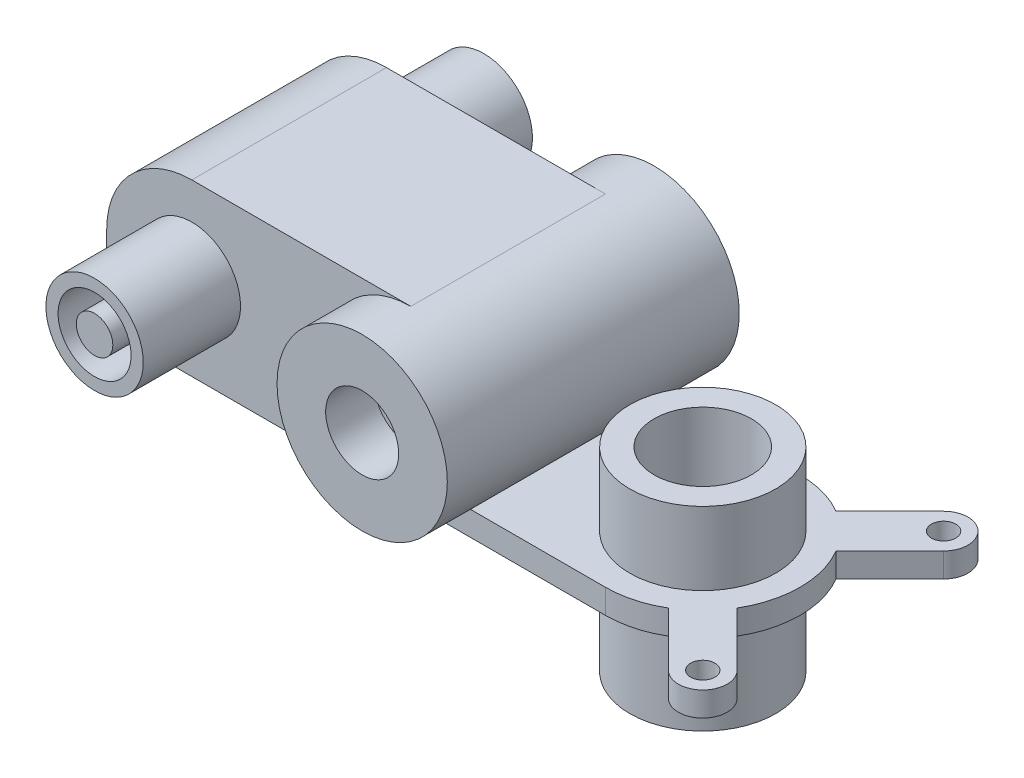
ISO-10303-21;
HEADER;
FILE_DESCRIPTION(('STEP AP214'),'2;1');
FILE_NAME('part.step','',(''),(''),'','','');
FILE_SCHEMA(('AUTOMOTIVE_DESIGN { 1 0 10303 214 1 1 1 1 }'));
ENDSEC;
DATA;
#1=APPLICATION_CONTEXT('core data for automotive mechanical design processes');
#2=APPLICATION_PROTOCOL_DEFINITION('international standard','automotive_design',2000,#1);
#3=PRODUCT_CONTEXT('',#1,'mechanical');
#4=PRODUCT('Part','Part','',(#3));
#5=PRODUCT_RELATED_PRODUCT_CATEGORY('part','',(#4));
#6=PRODUCT_DEFINITION_FORMATION('','',#4);
#7=PRODUCT_DEFINITION_CONTEXT('part definition',#1,'design');
#8=PRODUCT_DEFINITION('design','',#6,#7);
#9=PRODUCT_DEFINITION_SHAPE('','',#8);
#10=(LENGTH_UNIT() NAMED_UNIT(*) SI_UNIT(.MILLI.,.METRE.));
#11=(NAMED_UNIT(*) PLANE_ANGLE_UNIT() SI_UNIT($,.RADIAN.));
#12=(NAMED_UNIT(*) SI_UNIT($,.STERADIAN.) SOLID_ANGLE_UNIT());
#13=UNCERTAINTY_MEASURE_WITH_UNIT(LENGTH_MEASURE(1.E-05),#10,'distance_accuracy_value','');
#14=(GEOMETRIC_REPRESENTATION_CONTEXT(3) GLOBAL_UNCERTAINTY_ASSIGNED_CONTEXT((#13)) GLOBAL_UNIT_ASSIGNED_CONTEXT((#10,
#11,#12)) REPRESENTATION_CONTEXT('',''));
#15=CARTESIAN_POINT('',(0.,0.,0.));
#16=DIRECTION('',(0.,0.,1.));
#17=DIRECTION('',(1.,0.,0.));
#18=AXIS2_PLACEMENT_3D('',#15,#16,#17);
#19=CARTESIAN_POINT('',(-90.,0.,-80.));
#20=DIRECTION('',(0.,0.,1.));
#21=DIRECTION('',(1.,0.,0.));
#22=AXIS2_PLACEMENT_3D('',#19,#20,#21);
#23=CYLINDRICAL_SURFACE('',#22,35.);
#24=CARTESIAN_POINT('',(-90.,0.,0.));
#25=DIRECTION('',(0.,0.,1.));
#26=DIRECTION('',(1.,0.,0.));
#27=AXIS2_PLACEMENT_3D('',#24,#25,#26);
#28=CIRCLE('',#27,35.);
#29=CARTESIAN_POINT('',(-90.,35.,0.));
#30=VERTEX_POINT('',#29);
#31=CARTESIAN_POINT('',(-125.,0.,0.));
#32=VERTEX_POINT('',#31);
#33=EDGE_CURVE('E298',#30,#32,#28,.T.);
#34=ORIENTED_EDGE('',*,*,#33,.F.);
#35=DIRECTION('',(0.,0.,1.));
#36=VECTOR('',#35,1.);
#37=CARTESIAN_POINT('',(-90.,35.,-80.));
#38=LINE('',#37,#36);
#39=CARTESIAN_POINT('',(-90.,35.,-80.));
#40=VERTEX_POINT('',#39);
#41=EDGE_CURVE('E89',#40,#30,#38,.T.);
#42=ORIENTED_EDGE('',*,*,#41,.F.);
#43=CARTESIAN_POINT('',(-90.,0.,-80.));
#44=DIRECTION('',(0.,0.,1.));
#45=DIRECTION('',(1.,0.,0.));
#46=AXIS2_PLACEMENT_3D('',#43,#44,#45);
#47=CIRCLE('',#46,35.);
#48=CARTESIAN_POINT('',(-125.,0.,-80.));
#49=VERTEX_POINT('',#48);
#50=EDGE_CURVE('E302',#40,#49,#47,.T.);
#51=ORIENTED_EDGE('',*,*,#50,.T.);
#52=DIRECTION('',(0.,0.,1.));
#53=VECTOR('',#52,1.);
#54=CARTESIAN_POINT('',(-125.,0.,-80.));
#55=LINE('',#54,#53);
#56=EDGE_CURVE('E117',#49,#32,#55,.T.);
#57=ORIENTED_EDGE('',*,*,#56,.T.);
#58=EDGE_LOOP('',(#34,#42,#51,#57));
#59=FACE_BOUND('',#58,.T.);
#60=ADVANCED_FACE('F72',(#59),#23,.T.);
#61=CARTESIAN_POINT('',(0.,35.,-80.));
#62=DIRECTION('',(0.,-1.,0.));
#63=DIRECTION('',(1.,0.,0.));
#64=AXIS2_PLACEMENT_3D('',#61,#62,#63);
#65=PLANE('',#64);
#66=DIRECTION('',(1.,0.,0.));
#67=VECTOR('',#66,1.);
#68=CARTESIAN_POINT('',(0.,35.,0.));
#69=LINE('',#68,#67);
#70=CARTESIAN_POINT('',(0.,35.,0.));
#71=VERTEX_POINT('',#70);
#72=EDGE_CURVE('E306',#30,#71,#69,.T.);
#73=ORIENTED_EDGE('',*,*,#72,.T.);
#74=DIRECTION('',(0.,0.,1.));
#75=VECTOR('',#74,1.);
#76=CARTESIAN_POINT('',(0.,35.,-80.));
#77=LINE('',#76,#75);
#78=CARTESIAN_POINT('',(0.,35.,-80.));
#79=VERTEX_POINT('',#78);
#80=EDGE_CURVE('E330',#79,#71,#77,.T.);
#81=ORIENTED_EDGE('',*,*,#80,.F.);
#82=DIRECTION('',(1.,0.,0.));
#83=VECTOR('',#82,1.);
#84=CARTESIAN_POINT('',(0.,35.,-80.));
#85=LINE('',#84,#83);
#86=EDGE_CURVE('E312',#40,#79,#85,.T.);
#87=ORIENTED_EDGE('',*,*,#86,.F.);
#88=ORIENTED_EDGE('',*,*,#41,.T.);
#89=EDGE_LOOP('',(#73,#81,#87,#88));
#90=FACE_BOUND('',#89,.T.);
#91=ADVANCED_FACE('F369',(#90),#65,.F.);
#92=CARTESIAN_POINT('',(0.,0.,-80.));
#93=DIRECTION('',(0.,0.,1.));
#94=DIRECTION('',(1.,0.,0.));
#95=AXIS2_PLACEMENT_3D('',#92,#93,#94);
#96=CYLINDRICAL_SURFACE('',#95,35.);
#97=CARTESIAN_POINT('',(0.,0.,-80.));
#98=DIRECTION('',(0.,0.,-1.));
#99=DIRECTION('',(-1.,0.,0.));
#100=AXIS2_PLACEMENT_3D('',#97,#98,#99);
#101=CIRCLE('',#100,35.);
#102=CARTESIAN_POINT('',(0.,-35.,-80.));
#103=VERTEX_POINT('',#102);
#104=CARTESIAN_POINT('',(24.4948974278318,-25.,-80.));
#105=VERTEX_POINT('',#104);
#106=EDGE_CURVE('E12',#103,#105,#101,.F.);
#107=ORIENTED_EDGE('',*,*,#106,.F.);
#108=CARTESIAN_POINT('',(0.,0.,-80.));
#109=DIRECTION('',(0.,0.,-1.));
#110=DIRECTION('',(-1.,0.,0.));
#111=AXIS2_PLACEMENT_3D('',#108,#109,#110);
#112=CIRCLE('',#111,35.);
#113=EDGE_CURVE('E281',#103,#79,#112,.T.);
#114=ORIENTED_EDGE('',*,*,#113,.T.);
#115=ORIENTED_EDGE('',*,*,#80,.T.);
#116=CARTESIAN_POINT('',(0.,0.,0.));
#117=DIRECTION('',(0.,0.,1.));
#118=DIRECTION('',(1.,0.,0.));
#119=AXIS2_PLACEMENT_3D('',#116,#117,#118);
#120=CIRCLE('',#119,35.);
#121=CARTESIAN_POINT('',(0.,-35.,0.));
#122=VERTEX_POINT('',#121);
#123=EDGE_CURVE('E290',#71,#122,#120,.T.);
#124=ORIENTED_EDGE('',*,*,#123,.T.);
#125=CARTESIAN_POINT('',(0.,0.,0.));
#126=DIRECTION('',(0.,0.,1.));
#127=DIRECTION('',(1.,0.,0.));
#128=AXIS2_PLACEMENT_3D('',#125,#126,#127);
#129=CIRCLE('',#128,35.);
#130=CARTESIAN_POINT('',(24.4948974278318,-25.,0.));
#131=VERTEX_POINT('',#130);
#132=EDGE_CURVE('E81',#131,#122,#129,.F.);
#133=ORIENTED_EDGE('',*,*,#132,.F.);
#134=DIRECTION('',(0.,0.,1.));
#135=VECTOR('',#134,1.);
#136=CARTESIAN_POINT('',(24.4948974278318,-25.,-80.));
#137=LINE('',#136,#135);
#138=EDGE_CURVE('E350',#105,#131,#137,.T.);
#139=ORIENTED_EDGE('',*,*,#138,.F.);
#140=EDGE_LOOP('',(#107,#114,#115,#124,#133,#139));
#141=FACE_BOUND('',#140,.T.);
#142=CARTESIAN_POINT('',(0.,0.,20.));
#143=DIRECTION('',(0.,0.,1.));
#144=DIRECTION('',(1.,0.,0.));
#145=AXIS2_PLACEMENT_3D('',#142,#143,#144);
#146=CIRCLE('',#145,35.);
#147=CARTESIAN_POINT('',(35.,0.,20.));
#148=VERTEX_POINT('',#147);
#149=EDGE_CURVE('E294',#148,#148,#146,.T.);
#150=ORIENTED_EDGE('',*,*,#149,.F.);
#151=EDGE_LOOP('',(#150));
#152=FACE_BOUND('',#151,.T.);
#153=CARTESIAN_POINT('',(0.,0.,-100.));
#154=DIRECTION('',(0.,0.,-1.));
#155=DIRECTION('',(-1.,0.,0.));
#156=AXIS2_PLACEMENT_3D('',#153,#154,#155);
#157=CIRCLE('',#156,35.);
#158=CARTESIAN_POINT('',(-35.,0.,-100.));
#159=VERTEX_POINT('',#158);
#160=EDGE_CURVE('E273',#159,#159,#157,.T.);
#161=ORIENTED_EDGE('',*,*,#160,.F.);
#162=EDGE_LOOP('',(#161));
#163=FACE_BOUND('',#162,.T.);
#164=ADVANCED_FACE('F366',(#141,#152,#163),#96,.T.);
#165=CARTESIAN_POINT('',(0.,-35.,-80.));
#166=DIRECTION('',(0.,1.,0.));
#167=DIRECTION('',(0.,0.,1.));
#168=AXIS2_PLACEMENT_3D('',#165,#166,#167);
#169=PLANE('',#168);
#170=DIRECTION('',(-1.,0.,0.));
#171=VECTOR('',#170,1.);
#172=CARTESIAN_POINT('',(0.,-35.,0.));
#173=LINE('',#172,#171);
#174=CARTESIAN_POINT('',(-125.,-35.,0.));
#175=VERTEX_POINT('',#174);
#176=EDGE_CURVE('E323',#122,#175,#173,.T.);
#177=ORIENTED_EDGE('',*,*,#176,.T.);
#178=DIRECTION('',(0.,0.,1.));
#179=VECTOR('',#178,1.);
#180=CARTESIAN_POINT('',(-125.,-35.,-80.));
#181=LINE('',#180,#179);
#182=CARTESIAN_POINT('',(-125.,-35.,-80.));
#183=VERTEX_POINT('',#182);
#184=EDGE_CURVE('E334',#183,#175,#181,.T.);
#185=ORIENTED_EDGE('',*,*,#184,.F.);
#186=DIRECTION('',(-1.,0.,0.));
#187=VECTOR('',#186,1.);
#188=CARTESIAN_POINT('',(0.,-35.,-80.));
#189=LINE('',#188,#187);
#190=EDGE_CURVE('E309',#103,#183,#189,.T.);
#191=ORIENTED_EDGE('',*,*,#190,.F.);
#192=DIRECTION('',(1.,0.,0.));
#193=VECTOR('',#192,1.);
#194=CARTESIAN_POINT('',(0.,-35.,-80.));
#195=LINE('',#194,#193);
#196=CARTESIAN_POINT('',(80.,-35.,-80.));
#197=VERTEX_POINT('',#196);
#198=EDGE_CURVE('E379',#103,#197,#195,.T.);
#199=ORIENTED_EDGE('',*,*,#198,.T.);
#200=CARTESIAN_POINT('',(80.,-35.,-40.));
#201=DIRECTION('',(0.,1.,0.));
#202=DIRECTION('',(0.,0.,1.));
#203=AXIS2_PLACEMENT_3D('',#200,#201,#202);
#204=CIRCLE('',#203,40.);
#205=CARTESIAN_POINT('',(100.315060063393,-35.,-74.4571956871238));
#206=VERTEX_POINT('',#205);
#207=EDGE_CURVE('E382',#206,#197,#204,.T.);
#208=ORIENTED_EDGE('',*,*,#207,.F.);
#209=DIRECTION('',(0.707106781186547,0.,-0.707106781186548));
#210=VECTOR('',#209,1.);
#211=CARTESIAN_POINT('',(12.9289321881346,-35.,12.9289321881345));
#212=LINE('',#211,#210);
#213=CARTESIAN_POINT('',(122.426406871193,-35.,-96.5685424949238));
#214=VERTEX_POINT('',#213);
#215=EDGE_CURVE('E391',#206,#214,#212,.T.);
#216=ORIENTED_EDGE('',*,*,#215,.T.);
#217=CARTESIAN_POINT('',(129.497474683058,-35.,-89.4974746830584));
#218=DIRECTION('',(0.,1.,0.));
#219=DIRECTION('',(0.,0.,1.));
#220=AXIS2_PLACEMENT_3D('',#217,#218,#219);
#221=CIRCLE('',#220,10.0000000000001);
#222=CARTESIAN_POINT('',(136.568542494924,-35.,-82.4264068711929));
#223=VERTEX_POINT('',#222);
#224=EDGE_CURVE('E454',#223,#214,#221,.T.);
#225=ORIENTED_EDGE('',*,*,#224,.F.);
#226=DIRECTION('',(0.707106781186547,0.,-0.707106781186548));
#227=VECTOR('',#226,1.);
#228=CARTESIAN_POINT('',(27.0710678118656,-35.,27.0710678118655));
#229=LINE('',#228,#227);
#230=CARTESIAN_POINT('',(114.457195687124,-35.,-60.3150600633928));
#231=VERTEX_POINT('',#230);
#232=EDGE_CURVE('E441',#231,#223,#229,.T.);
#233=ORIENTED_EDGE('',*,*,#232,.F.);
#234=CARTESIAN_POINT('',(80.,-35.,-40.));
#235=DIRECTION('',(0.,1.,0.));
#236=DIRECTION('',(0.,0.,1.));
#237=AXIS2_PLACEMENT_3D('',#234,#235,#236);
#238=CIRCLE('',#237,40.);
#239=CARTESIAN_POINT('',(114.457195687124,-35.,-19.6849399366071));
#240=VERTEX_POINT('',#239);
#241=EDGE_CURVE('E433',#240,#231,#238,.T.);
#242=ORIENTED_EDGE('',*,*,#241,.F.);
#243=DIRECTION('',(0.707106781186548,0.,0.707106781186547));
#244=VECTOR('',#243,1.);
#245=CARTESIAN_POINT('',(67.0710678118654,-35.,-67.0710678118655));
#246=LINE('',#245,#244);
#247=CARTESIAN_POINT('',(136.568542494924,-35.,2.42640687119286));
#248=VERTEX_POINT('',#247);
#249=EDGE_CURVE('E439',#240,#248,#246,.T.);
#250=ORIENTED_EDGE('',*,*,#249,.T.);
#251=CARTESIAN_POINT('',(129.497474683058,-35.,9.49747468305841));
#252=DIRECTION('',(0.,1.,0.));
#253=DIRECTION('',(0.,0.,1.));
#254=AXIS2_PLACEMENT_3D('',#251,#252,#253);
#255=CIRCLE('',#254,10.0000000000001);
#256=CARTESIAN_POINT('',(122.426406871193,-35.,16.5685424949238));
#257=VERTEX_POINT('',#256);
#258=EDGE_CURVE('E446',#257,#248,#255,.T.);
#259=ORIENTED_EDGE('',*,*,#258,.F.);
#260=DIRECTION('',(0.707106781186548,0.,0.707106781186547));
#261=VECTOR('',#260,1.);
#262=CARTESIAN_POINT('',(52.9289321881345,-35.,-52.9289321881345));
#263=LINE('',#262,#261);
#264=CARTESIAN_POINT('',(100.315060063393,-35.,-5.5428043128762));
#265=VERTEX_POINT('',#264);
#266=EDGE_CURVE('E224',#265,#257,#263,.T.);
#267=ORIENTED_EDGE('',*,*,#266,.F.);
#268=CARTESIAN_POINT('',(80.,-35.,-40.));
#269=DIRECTION('',(0.,1.,0.));
#270=DIRECTION('',(0.,0.,1.));
#271=AXIS2_PLACEMENT_3D('',#268,#269,#270);
#272=CIRCLE('',#271,40.);
#273=CARTESIAN_POINT('',(80.,-35.,0.));
#274=VERTEX_POINT('',#273);
#275=EDGE_CURVE('E389',#274,#265,#272,.T.);
#276=ORIENTED_EDGE('',*,*,#275,.F.);
#277=DIRECTION('',(-1.,0.,0.));
#278=VECTOR('',#277,1.);
#279=CARTESIAN_POINT('',(0.,-35.,0.));
#280=LINE('',#279,#278);
#281=EDGE_CURVE('E108',#274,#122,#280,.T.);
#282=ORIENTED_EDGE('',*,*,#281,.T.);
#283=EDGE_LOOP('',(#177,#185,#191,#199,#208,#216,#225,#233,#242,#250,#259,#267,#276,#282));
#284=FACE_BOUND('',#283,.T.);
#285=CARTESIAN_POINT('',(80.,-35.,-40.));
#286=DIRECTION('',(0.,1.,0.));
#287=DIRECTION('',(0.,0.,1.));
#288=AXIS2_PLACEMENT_3D('',#285,#286,#287);
#289=CIRCLE('',#288,30.);
#290=CARTESIAN_POINT('',(80.,-35.,-10.));
#291=VERTEX_POINT('',#290);
#292=EDGE_CURVE('E506',#291,#291,#289,.F.);
#293=ORIENTED_EDGE('',*,*,#292,.F.);
#294=EDGE_LOOP('',(#293));
#295=FACE_BOUND('',#294,.T.);
#296=CARTESIAN_POINT('',(129.497474683058,-35.,9.49747468305841));
#297=DIRECTION('',(0.,1.,0.));
#298=DIRECTION('',(0.,0.,1.));
#299=AXIS2_PLACEMENT_3D('',#296,#297,#298);
#300=CIRCLE('',#299,4.99999999999999);
#301=CARTESIAN_POINT('',(129.497474683058,-35.,14.4974746830584));
#302=VERTEX_POINT('',#301);
#303=EDGE_CURVE('E397',#302,#302,#300,.T.);
#304=ORIENTED_EDGE('',*,*,#303,.T.);
#305=EDGE_LOOP('',(#304));
#306=FACE_BOUND('',#305,.T.);
#307=CARTESIAN_POINT('',(129.497474683058,-35.,-89.4974746830584));
#308=DIRECTION('',(0.,1.,0.));
#309=DIRECTION('',(0.,0.,1.));
#310=AXIS2_PLACEMENT_3D('',#307,#308,#309);
#311=CIRCLE('',#310,5.00000000000002);
#312=CARTESIAN_POINT('',(129.497474683058,-35.,-84.4974746830584));
#313=VERTEX_POINT('',#312);
#314=EDGE_CURVE('E220',#313,#313,#311,.T.);
#315=ORIENTED_EDGE('',*,*,#314,.T.);
#316=EDGE_LOOP('',(#315));
#317=FACE_BOUND('',#316,.T.);
#318=ADVANCED_FACE('F375',(#284,#295,#306,#317),#169,.F.);
#319=CARTESIAN_POINT('',(-125.,0.,-80.));
#320=DIRECTION('',(-1.,0.,0.));
#321=DIRECTION('',(0.,0.,1.));
#322=AXIS2_PLACEMENT_3D('',#319,#320,#321);
#323=PLANE('',#322);
#324=DIRECTION('',(0.,-1.,0.));
#325=VECTOR('',#324,1.);
#326=CARTESIAN_POINT('',(-125.,0.,0.));
#327=LINE('',#326,#325);
#328=EDGE_CURVE('E319',#32,#175,#327,.T.);
#329=ORIENTED_EDGE('',*,*,#328,.F.);
#330=ORIENTED_EDGE('',*,*,#56,.F.);
#331=DIRECTION('',(0.,-1.,0.));
#332=VECTOR('',#331,1.);
#333=CARTESIAN_POINT('',(-125.,0.,-80.));
#334=LINE('',#333,#332);
#335=EDGE_CURVE('E305',#49,#183,#334,.T.);
#336=ORIENTED_EDGE('',*,*,#335,.T.);
#337=ORIENTED_EDGE('',*,*,#184,.T.);
#338=EDGE_LOOP('',(#329,#330,#336,#337));
#339=FACE_BOUND('',#338,.T.);
#340=ADVANCED_FACE('F374',(#339),#323,.T.);
#341=CARTESIAN_POINT('',(0.,0.,-80.));
#342=DIRECTION('',(0.,0.,1.));
#343=DIRECTION('',(1.,0.,0.));
#344=AXIS2_PLACEMENT_3D('',#341,#342,#343);
#345=PLANE('',#344);
#346=CARTESIAN_POINT('',(-90.,0.,-80.));
#347=DIRECTION('',(0.,0.,1.));
#348=DIRECTION('',(1.,0.,0.));
#349=AXIS2_PLACEMENT_3D('',#346,#347,#348);
#350=CIRCLE('',#349,20.);
#351=CARTESIAN_POINT('',(-70.,0.,-80.));
#352=VERTEX_POINT('',#351);
#353=EDGE_CURVE('E342',#352,#352,#350,.F.);
#354=ORIENTED_EDGE('',*,*,#353,.F.);
#355=EDGE_LOOP('',(#354));
#356=FACE_BOUND('',#355,.T.);
#357=ORIENTED_EDGE('',*,*,#113,.F.);
#358=ORIENTED_EDGE('',*,*,#190,.T.);
#359=ORIENTED_EDGE('',*,*,#335,.F.);
#360=ORIENTED_EDGE('',*,*,#50,.F.);
#361=ORIENTED_EDGE('',*,*,#86,.T.);
#362=EDGE_LOOP('',(#357,#358,#359,#360,#361));
#363=FACE_BOUND('',#362,.T.);
#364=ADVANCED_FACE('F372',(#356,#363),#345,.F.);
#365=CARTESIAN_POINT('',(0.,0.,0.));
#366=DIRECTION('',(0.,0.,1.));
#367=DIRECTION('',(1.,0.,0.));
#368=AXIS2_PLACEMENT_3D('',#365,#366,#367);
#369=PLANE('',#368);
#370=CARTESIAN_POINT('',(-90.,0.,0.));
#371=DIRECTION('',(0.,0.,1.));
#372=DIRECTION('',(1.,0.,0.));
#373=AXIS2_PLACEMENT_3D('',#370,#371,#372);
#374=CIRCLE('',#373,20.);
#375=CARTESIAN_POINT('',(-70.,0.,0.));
#376=VERTEX_POINT('',#375);
#377=EDGE_CURVE('E253',#376,#376,#374,.T.);
#378=ORIENTED_EDGE('',*,*,#377,.F.);
#379=EDGE_LOOP('',(#378));
#380=FACE_BOUND('',#379,.T.);
#381=ORIENTED_EDGE('',*,*,#123,.F.);
#382=ORIENTED_EDGE('',*,*,#72,.F.);
#383=ORIENTED_EDGE('',*,*,#33,.T.);
#384=ORIENTED_EDGE('',*,*,#328,.T.);
#385=ORIENTED_EDGE('',*,*,#176,.F.);
#386=EDGE_LOOP('',(#381,#382,#383,#384,#385));
#387=FACE_BOUND('',#386,.T.);
#388=ADVANCED_FACE('F363',(#380,#387),#369,.T.);
#389=CARTESIAN_POINT('',(0.,0.,20.));
#390=DIRECTION('',(0.,0.,1.));
#391=DIRECTION('',(1.,0.,0.));
#392=AXIS2_PLACEMENT_3D('',#389,#390,#391);
#393=PLANE('',#392);
#394=ORIENTED_EDGE('',*,*,#149,.T.);
#395=EDGE_LOOP('',(#394));
#396=FACE_BOUND('',#395,.T.);
#397=CARTESIAN_POINT('',(0.,0.,20.));
#398=DIRECTION('',(0.,0.,1.));
#399=DIRECTION('',(1.,0.,0.));
#400=AXIS2_PLACEMENT_3D('',#397,#398,#399);
#401=CIRCLE('',#400,15.);
#402=CARTESIAN_POINT('',(15.,0.,20.));
#403=VERTEX_POINT('',#402);
#404=EDGE_CURVE('E286',#403,#403,#401,.T.);
#405=ORIENTED_EDGE('',*,*,#404,.F.);
#406=EDGE_LOOP('',(#405));
#407=FACE_BOUND('',#406,.T.);
#408=ADVANCED_FACE('F572',(#396,#407),#393,.T.);
#409=CARTESIAN_POINT('',(0.,0.,20.));
#410=DIRECTION('',(0.,0.,-1.));
#411=DIRECTION('',(-1.,0.,0.));
#412=AXIS2_PLACEMENT_3D('',#409,#410,#411);
#413=CYLINDRICAL_SURFACE('',#412,15.);
#414=ORIENTED_EDGE('',*,*,#404,.T.);
#415=EDGE_LOOP('',(#414));
#416=FACE_BOUND('',#415,.T.);
#417=CARTESIAN_POINT('',(0.,0.,0.));
#418=DIRECTION('',(0.,0.,1.));
#419=DIRECTION('',(1.,0.,0.));
#420=AXIS2_PLACEMENT_3D('',#417,#418,#419);
#421=CIRCLE('',#420,15.);
#422=CARTESIAN_POINT('',(15.,0.,0.));
#423=VERTEX_POINT('',#422);
#424=EDGE_CURVE('E280',#423,#423,#421,.T.);
#425=ORIENTED_EDGE('',*,*,#424,.F.);
#426=EDGE_LOOP('',(#425));
#427=FACE_BOUND('',#426,.T.);
#428=ADVANCED_FACE('F605',(#416,#427),#413,.F.);
#429=ORIENTED_EDGE('',*,*,#424,.T.);
#430=EDGE_LOOP('',(#429));
#431=FACE_BOUND('',#430,.T.);
#432=ADVANCED_FACE('F575',(#431),#369,.T.);
#433=CARTESIAN_POINT('',(0.,0.,-100.));
#434=DIRECTION('',(0.,0.,-1.));
#435=DIRECTION('',(-1.,0.,0.));
#436=AXIS2_PLACEMENT_3D('',#433,#434,#435);
#437=PLANE('',#436);
#438=ORIENTED_EDGE('',*,*,#160,.T.);
#439=EDGE_LOOP('',(#438));
#440=FACE_BOUND('',#439,.T.);
#441=CARTESIAN_POINT('',(0.,0.,-100.));
#442=DIRECTION('',(0.,0.,-1.));
#443=DIRECTION('',(-1.,0.,0.));
#444=AXIS2_PLACEMENT_3D('',#441,#442,#443);
#445=CIRCLE('',#444,15.);
#446=CARTESIAN_POINT('',(-15.,0.,-100.));
#447=VERTEX_POINT('',#446);
#448=EDGE_CURVE('E269',#447,#447,#445,.T.);
#449=ORIENTED_EDGE('',*,*,#448,.F.);
#450=EDGE_LOOP('',(#449));
#451=FACE_BOUND('',#450,.T.);
#452=ADVANCED_FACE('F593',(#440,#451),#437,.T.);
#453=CARTESIAN_POINT('',(0.,0.,-100.));
#454=DIRECTION('',(0.,0.,1.));
#455=DIRECTION('',(1.,0.,0.));
#456=AXIS2_PLACEMENT_3D('',#453,#454,#455);
#457=CYLINDRICAL_SURFACE('',#456,15.);
#458=ORIENTED_EDGE('',*,*,#448,.T.);
#459=EDGE_LOOP('',(#458));
#460=FACE_BOUND('',#459,.T.);
#461=CARTESIAN_POINT('',(0.,0.,-80.));
#462=DIRECTION('',(0.,0.,-1.));
#463=DIRECTION('',(-1.,0.,0.));
#464=AXIS2_PLACEMENT_3D('',#461,#462,#463);
#465=CIRCLE('',#464,15.);
#466=CARTESIAN_POINT('',(-15.,0.,-80.));
#467=VERTEX_POINT('',#466);
#468=EDGE_CURVE('E265',#467,#467,#465,.T.);
#469=ORIENTED_EDGE('',*,*,#468,.F.);
#470=EDGE_LOOP('',(#469));
#471=FACE_BOUND('',#470,.T.);
#472=ADVANCED_FACE('F584',(#460,#471),#457,.F.);
#473=ORIENTED_EDGE('',*,*,#468,.T.);
#474=EDGE_LOOP('',(#473));
#475=FACE_BOUND('',#474,.T.);
#476=ADVANCED_FACE('F568',(#475),#345,.F.);
#477=CARTESIAN_POINT('',(-90.,0.,40.));
#478=DIRECTION('',(0.,0.,-1.));
#479=DIRECTION('',(-1.,0.,0.));
#480=AXIS2_PLACEMENT_3D('',#477,#478,#479);
#481=CYLINDRICAL_SURFACE('',#480,15.);
#482=CARTESIAN_POINT('',(-90.,0.,40.));
#483=DIRECTION('',(0.,0.,1.));
#484=DIRECTION('',(1.,0.,0.));
#485=AXIS2_PLACEMENT_3D('',#482,#483,#484);
#486=CIRCLE('',#485,15.);
#487=CARTESIAN_POINT('',(-75.,0.,40.));
#488=VERTEX_POINT('',#487);
#489=EDGE_CURVE('E257',#488,#488,#486,.T.);
#490=ORIENTED_EDGE('',*,*,#489,.T.);
#491=EDGE_LOOP('',(#490));
#492=FACE_BOUND('',#491,.T.);
#493=CARTESIAN_POINT('',(-90.,0.,0.));
#494=DIRECTION('',(0.,0.,1.));
#495=DIRECTION('',(1.,0.,0.));
#496=AXIS2_PLACEMENT_3D('',#493,#494,#495);
#497=CIRCLE('',#496,15.);
#498=CARTESIAN_POINT('',(-75.,0.,0.));
#499=VERTEX_POINT('',#498);
#500=EDGE_CURVE('E285',#499,#499,#497,.F.);
#501=ORIENTED_EDGE('',*,*,#500,.T.);
#502=EDGE_LOOP('',(#501));
#503=FACE_BOUND('',#502,.T.);
#504=ADVANCED_FACE('F583',(#492,#503),#481,.F.);
#505=CARTESIAN_POINT('',(-90.,0.,40.));
#506=DIRECTION('',(0.,0.,-1.));
#507=DIRECTION('',(-1.,0.,0.));
#508=AXIS2_PLACEMENT_3D('',#505,#506,#507);
#509=CYLINDRICAL_SURFACE('',#508,20.);
#510=CARTESIAN_POINT('',(-90.,0.,40.));
#511=DIRECTION('',(0.,0.,1.));
#512=DIRECTION('',(1.,0.,0.));
#513=AXIS2_PLACEMENT_3D('',#510,#511,#512);
#514=CIRCLE('',#513,20.);
#515=CARTESIAN_POINT('',(-70.,0.,40.));
#516=VERTEX_POINT('',#515);
#517=EDGE_CURVE('E261',#516,#516,#514,.T.);
#518=ORIENTED_EDGE('',*,*,#517,.F.);
#519=EDGE_LOOP('',(#518));
#520=FACE_BOUND('',#519,.T.);
#521=ORIENTED_EDGE('',*,*,#377,.T.);
#522=EDGE_LOOP('',(#521));
#523=FACE_BOUND('',#522,.T.);
#524=ADVANCED_FACE('F590',(#520,#523),#509,.T.);
#525=CARTESIAN_POINT('',(0.,0.,40.));
#526=DIRECTION('',(0.,0.,1.));
#527=DIRECTION('',(1.,0.,0.));
#528=AXIS2_PLACEMENT_3D('',#525,#526,#527);
#529=PLANE('',#528);
#530=ORIENTED_EDGE('',*,*,#489,.F.);
#531=EDGE_LOOP('',(#530));
#532=FACE_BOUND('',#531,.T.);
#533=ORIENTED_EDGE('',*,*,#517,.T.);
#534=EDGE_LOOP('',(#533));
#535=FACE_BOUND('',#534,.T.);
#536=ADVANCED_FACE('F623',(#532,#535),#529,.T.);
#537=CARTESIAN_POINT('',(-90.,0.,0.));
#538=DIRECTION('',(0.,0.,1.));
#539=DIRECTION('',(1.,0.,0.));
#540=AXIS2_PLACEMENT_3D('',#537,#538,#539);
#541=CIRCLE('',#540,7.50000000000001);
#542=CARTESIAN_POINT('',(-82.5,0.,0.));
#543=VERTEX_POINT('',#542);
#544=EDGE_CURVE('E245',#543,#543,#541,.T.);
#545=ORIENTED_EDGE('',*,*,#544,.F.);
#546=EDGE_LOOP('',(#545));
#547=FACE_BOUND('',#546,.T.);
#548=ORIENTED_EDGE('',*,*,#500,.F.);
#549=EDGE_LOOP('',(#548));
#550=FACE_BOUND('',#549,.T.);
#551=ADVANCED_FACE('F574',(#547,#550),#369,.T.);
#552=CARTESIAN_POINT('',(-90.,0.,40.));
#553=DIRECTION('',(0.,0.,-1.));
#554=DIRECTION('',(-1.,0.,0.));
#555=AXIS2_PLACEMENT_3D('',#552,#553,#554);
#556=CYLINDRICAL_SURFACE('',#555,7.50000000000001);
#557=CARTESIAN_POINT('',(-90.,0.,40.));
#558=DIRECTION('',(0.,0.,1.));
#559=DIRECTION('',(1.,0.,0.));
#560=AXIS2_PLACEMENT_3D('',#557,#558,#559);
#561=CIRCLE('',#560,7.50000000000001);
#562=CARTESIAN_POINT('',(-82.5,0.,40.));
#563=VERTEX_POINT('',#562);
#564=EDGE_CURVE('E249',#563,#563,#561,.T.);
#565=ORIENTED_EDGE('',*,*,#564,.F.);
#566=EDGE_LOOP('',(#565));
#567=FACE_BOUND('',#566,.T.);
#568=ORIENTED_EDGE('',*,*,#544,.T.);
#569=EDGE_LOOP('',(#568));
#570=FACE_BOUND('',#569,.T.);
#571=ADVANCED_FACE('F622',(#567,#570),#556,.T.);
#572=CARTESIAN_POINT('',(0.,0.,40.));
#573=DIRECTION('',(0.,0.,1.));
#574=DIRECTION('',(1.,0.,0.));
#575=AXIS2_PLACEMENT_3D('',#572,#573,#574);
#576=PLANE('',#575);
#577=ORIENTED_EDGE('',*,*,#564,.T.);
#578=EDGE_LOOP('',(#577));
#579=FACE_BOUND('',#578,.T.);
#580=ADVANCED_FACE('F629',(#579),#576,.T.);
#581=CARTESIAN_POINT('',(-90.,0.,-120.));
#582=DIRECTION('',(0.,0.,1.));
#583=DIRECTION('',(1.,0.,0.));
#584=AXIS2_PLACEMENT_3D('',#581,#582,#583);
#585=CYLINDRICAL_SURFACE('',#584,15.);
#586=CARTESIAN_POINT('',(-90.,0.,-120.));
#587=DIRECTION('',(0.,0.,-1.));
#588=DIRECTION('',(-1.,0.,0.));
#589=AXIS2_PLACEMENT_3D('',#586,#587,#588);
#590=CIRCLE('',#589,15.);
#591=CARTESIAN_POINT('',(-105.,0.,-120.));
#592=VERTEX_POINT('',#591);
#593=EDGE_CURVE('E237',#592,#592,#590,.T.);
#594=ORIENTED_EDGE('',*,*,#593,.T.);
#595=EDGE_LOOP('',(#594));
#596=FACE_BOUND('',#595,.T.);
#597=CARTESIAN_POINT('',(-90.,0.,-80.));
#598=DIRECTION('',(0.,0.,-1.));
#599=DIRECTION('',(-1.,0.,0.));
#600=AXIS2_PLACEMENT_3D('',#597,#598,#599);
#601=CIRCLE('',#600,15.);
#602=CARTESIAN_POINT('',(-105.,0.,-80.));
#603=VERTEX_POINT('',#602);
#604=EDGE_CURVE('E231',#603,#603,#601,.T.);
#605=ORIENTED_EDGE('',*,*,#604,.F.);
#606=EDGE_LOOP('',(#605));
#607=FACE_BOUND('',#606,.T.);
#608=ADVANCED_FACE('F648',(#596,#607),#585,.F.);
#609=CARTESIAN_POINT('',(-90.,0.,-120.));
#610=DIRECTION('',(0.,0.,1.));
#611=DIRECTION('',(1.,0.,0.));
#612=AXIS2_PLACEMENT_3D('',#609,#610,#611);
#613=CYLINDRICAL_SURFACE('',#612,20.);
#614=CARTESIAN_POINT('',(-90.,0.,-120.));
#615=DIRECTION('',(0.,0.,-1.));
#616=DIRECTION('',(-1.,0.,0.));
#617=AXIS2_PLACEMENT_3D('',#614,#615,#616);
#618=CIRCLE('',#617,20.);
#619=CARTESIAN_POINT('',(-110.,0.,-120.));
#620=VERTEX_POINT('',#619);
#621=EDGE_CURVE('E241',#620,#620,#618,.T.);
#622=ORIENTED_EDGE('',*,*,#621,.F.);
#623=EDGE_LOOP('',(#622));
#624=FACE_BOUND('',#623,.T.);
#625=ORIENTED_EDGE('',*,*,#353,.T.);
#626=EDGE_LOOP('',(#625));
#627=FACE_BOUND('',#626,.T.);
#628=ADVANCED_FACE('F652',(#624,#627),#613,.T.);
#629=CARTESIAN_POINT('',(0.,0.,-120.));
#630=DIRECTION('',(0.,0.,-1.));
#631=DIRECTION('',(-1.,0.,0.));
#632=AXIS2_PLACEMENT_3D('',#629,#630,#631);
#633=PLANE('',#632);
#634=ORIENTED_EDGE('',*,*,#593,.F.);
#635=EDGE_LOOP('',(#634));
#636=FACE_BOUND('',#635,.T.);
#637=ORIENTED_EDGE('',*,*,#621,.T.);
#638=EDGE_LOOP('',(#637));
#639=FACE_BOUND('',#638,.T.);
#640=ADVANCED_FACE('F580',(#636,#639),#633,.T.);
#641=CARTESIAN_POINT('',(-90.,0.,-80.));
#642=DIRECTION('',(0.,0.,1.));
#643=DIRECTION('',(1.,0.,0.));
#644=AXIS2_PLACEMENT_3D('',#641,#642,#643);
#645=CIRCLE('',#644,7.50000000000001);
#646=CARTESIAN_POINT('',(-82.5,0.,-80.));
#647=VERTEX_POINT('',#646);
#648=EDGE_CURVE('E346',#647,#647,#645,.F.);
#649=ORIENTED_EDGE('',*,*,#648,.F.);
#650=EDGE_LOOP('',(#649));
#651=FACE_BOUND('',#650,.T.);
#652=ORIENTED_EDGE('',*,*,#604,.T.);
#653=EDGE_LOOP('',(#652));
#654=FACE_BOUND('',#653,.T.);
#655=ADVANCED_FACE('F567',(#651,#654),#345,.F.);
#656=CARTESIAN_POINT('',(-90.,0.,-120.));
#657=DIRECTION('',(0.,0.,1.));
#658=DIRECTION('',(1.,0.,0.));
#659=AXIS2_PLACEMENT_3D('',#656,#657,#658);
#660=CYLINDRICAL_SURFACE('',#659,7.50000000000001);
#661=CARTESIAN_POINT('',(-90.,0.,-120.));
#662=DIRECTION('',(0.,0.,-1.));
#663=DIRECTION('',(-1.,0.,0.));
#664=AXIS2_PLACEMENT_3D('',#661,#662,#663);
#665=CIRCLE('',#664,7.50000000000001);
#666=CARTESIAN_POINT('',(-97.5,0.,-120.));
#667=VERTEX_POINT('',#666);
#668=EDGE_CURVE('E226',#667,#667,#665,.T.);
#669=ORIENTED_EDGE('',*,*,#668,.F.);
#670=EDGE_LOOP('',(#669));
#671=FACE_BOUND('',#670,.T.);
#672=ORIENTED_EDGE('',*,*,#648,.T.);
#673=EDGE_LOOP('',(#672));
#674=FACE_BOUND('',#673,.T.);
#675=ADVANCED_FACE('F579',(#671,#674),#660,.T.);
#676=CARTESIAN_POINT('',(0.,0.,-120.));
#677=DIRECTION('',(0.,0.,-1.));
#678=DIRECTION('',(-1.,0.,0.));
#679=AXIS2_PLACEMENT_3D('',#676,#677,#678);
#680=PLANE('',#679);
#681=ORIENTED_EDGE('',*,*,#668,.T.);
#682=EDGE_LOOP('',(#681));
#683=FACE_BOUND('',#682,.T.);
#684=ADVANCED_FACE('F662',(#683),#680,.T.);
#685=CARTESIAN_POINT('',(52.9289321881345,-25.,-52.9289321881345));
#686=DIRECTION('',(0.707106781186547,0.,-0.707106781186548));
#687=DIRECTION('',(-0.707106781186548,0.,-0.707106781186547));
#688=AXIS2_PLACEMENT_3D('',#685,#686,#687);
#689=PLANE('',#688);
#690=ORIENTED_EDGE('',*,*,#266,.T.);
#691=DIRECTION('',(0.,-1.,0.));
#692=VECTOR('',#691,1.);
#693=CARTESIAN_POINT('',(122.426406871193,-25.,16.5685424949238));
#694=LINE('',#693,#692);
#695=CARTESIAN_POINT('',(122.426406871193,-25.,16.5685424949238));
#696=VERTEX_POINT('',#695);
#697=EDGE_CURVE('E199',#696,#257,#694,.T.);
#698=ORIENTED_EDGE('',*,*,#697,.F.);
#699=DIRECTION('',(0.707106781186548,0.,0.707106781186547));
#700=VECTOR('',#699,1.);
#701=CARTESIAN_POINT('',(52.9289321881345,-25.,-52.9289321881345));
#702=LINE('',#701,#700);
#703=CARTESIAN_POINT('',(100.315060063393,-25.,-5.5428043128762));
#704=VERTEX_POINT('',#703);
#705=EDGE_CURVE('E207',#704,#696,#702,.T.);
#706=ORIENTED_EDGE('',*,*,#705,.F.);
#707=DIRECTION('',(0.,-1.,0.));
#708=VECTOR('',#707,1.);
#709=CARTESIAN_POINT('',(100.315060063393,-25.,-5.5428043128762));
#710=LINE('',#709,#708);
#711=EDGE_CURVE('E404',#704,#265,#710,.T.);
#712=ORIENTED_EDGE('',*,*,#711,.T.);
#713=EDGE_LOOP('',(#690,#698,#706,#712));
#714=FACE_BOUND('',#713,.T.);
#715=ADVANCED_FACE('F222',(#714),#689,.F.);
#716=CARTESIAN_POINT('',(129.497474683058,-25.,9.49747468305841));
#717=DIRECTION('',(0.,-1.,0.));
#718=DIRECTION('',(0.,0.,-1.));
#719=AXIS2_PLACEMENT_3D('',#716,#717,#718);
#720=CYLINDRICAL_SURFACE('',#719,10.0000000000001);
#721=ORIENTED_EDGE('',*,*,#258,.T.);
#722=DIRECTION('',(0.,-1.,0.));
#723=VECTOR('',#722,1.);
#724=CARTESIAN_POINT('',(136.568542494924,-25.,2.42640687119286));
#725=LINE('',#724,#723);
#726=CARTESIAN_POINT('',(136.568542494924,-25.,2.42640687119286));
#727=VERTEX_POINT('',#726);
#728=EDGE_CURVE('E201',#727,#248,#725,.T.);
#729=ORIENTED_EDGE('',*,*,#728,.F.);
#730=CARTESIAN_POINT('',(129.497474683058,-25.,9.49747468305841));
#731=DIRECTION('',(0.,1.,0.));
#732=DIRECTION('',(0.,0.,1.));
#733=AXIS2_PLACEMENT_3D('',#730,#731,#732);
#734=CIRCLE('',#733,10.0000000000001);
#735=EDGE_CURVE('E194',#696,#727,#734,.T.);
#736=ORIENTED_EDGE('',*,*,#735,.F.);
#737=ORIENTED_EDGE('',*,*,#697,.T.);
#738=EDGE_LOOP('',(#721,#729,#736,#737));
#739=FACE_BOUND('',#738,.T.);
#740=ADVANCED_FACE('F197',(#739),#720,.T.);
#741=CARTESIAN_POINT('',(67.0710678118654,-25.,-67.0710678118655));
#742=DIRECTION('',(0.707106781186547,0.,-0.707106781186548));
#743=DIRECTION('',(-0.707106781186548,0.,-0.707106781186547));
#744=AXIS2_PLACEMENT_3D('',#741,#742,#743);
#745=PLANE('',#744);
#746=ORIENTED_EDGE('',*,*,#249,.F.);
#747=DIRECTION('',(0.,-1.,0.));
#748=VECTOR('',#747,1.);
#749=CARTESIAN_POINT('',(114.457195687124,-25.,-19.6849399366071));
#750=LINE('',#749,#748);
#751=CARTESIAN_POINT('',(114.457195687124,-25.,-19.6849399366071));
#752=VERTEX_POINT('',#751);
#753=EDGE_CURVE('E233',#752,#240,#750,.T.);
#754=ORIENTED_EDGE('',*,*,#753,.F.);
#755=DIRECTION('',(0.707106781186548,0.,0.707106781186547));
#756=VECTOR('',#755,1.);
#757=CARTESIAN_POINT('',(67.0710678118654,-25.,-67.0710678118655));
#758=LINE('',#757,#756);
#759=EDGE_CURVE('E206',#752,#727,#758,.T.);
#760=ORIENTED_EDGE('',*,*,#759,.T.);
#761=ORIENTED_EDGE('',*,*,#728,.T.);
#762=EDGE_LOOP('',(#746,#754,#760,#761));
#763=FACE_BOUND('',#762,.T.);
#764=ADVANCED_FACE('F444',(#763),#745,.T.);
#765=CARTESIAN_POINT('',(80.,-25.,-40.));
#766=DIRECTION('',(0.,-1.,0.));
#767=DIRECTION('',(0.,0.,-1.));
#768=AXIS2_PLACEMENT_3D('',#765,#766,#767);
#769=CYLINDRICAL_SURFACE('',#768,40.);
#770=ORIENTED_EDGE('',*,*,#241,.T.);
#771=DIRECTION('',(0.,-1.,0.));
#772=VECTOR('',#771,1.);
#773=CARTESIAN_POINT('',(114.457195687124,-25.,-60.3150600633928));
#774=LINE('',#773,#772);
#775=CARTESIAN_POINT('',(114.457195687124,-25.,-60.3150600633928));
#776=VERTEX_POINT('',#775);
#777=EDGE_CURVE('E424',#776,#231,#774,.T.);
#778=ORIENTED_EDGE('',*,*,#777,.F.);
#779=CARTESIAN_POINT('',(80.,-25.,-40.));
#780=DIRECTION('',(0.,1.,0.));
#781=DIRECTION('',(0.,0.,1.));
#782=AXIS2_PLACEMENT_3D('',#779,#780,#781);
#783=CIRCLE('',#782,40.);
#784=EDGE_CURVE('E434',#752,#776,#783,.T.);
#785=ORIENTED_EDGE('',*,*,#784,.F.);
#786=ORIENTED_EDGE('',*,*,#753,.T.);
#787=EDGE_LOOP('',(#770,#778,#785,#786));
#788=FACE_BOUND('',#787,.T.);
#789=ADVANCED_FACE('F431',(#788),#769,.T.);
#790=CARTESIAN_POINT('',(27.0710678118656,-25.,27.0710678118655));
#791=DIRECTION('',(-0.707106781186548,0.,-0.707106781186547));
#792=DIRECTION('',(-0.707106781186547,0.,0.707106781186548));
#793=AXIS2_PLACEMENT_3D('',#790,#791,#792);
#794=PLANE('',#793);
#795=ORIENTED_EDGE('',*,*,#232,.T.);
#796=DIRECTION('',(0.,-1.,0.));
#797=VECTOR('',#796,1.);
#798=CARTESIAN_POINT('',(136.568542494924,-25.,-82.4264068711929));
#799=LINE('',#798,#797);
#800=CARTESIAN_POINT('',(136.568542494924,-25.,-82.4264068711929));
#801=VERTEX_POINT('',#800);
#802=EDGE_CURVE('E420',#801,#223,#799,.T.);
#803=ORIENTED_EDGE('',*,*,#802,.F.);
#804=DIRECTION('',(0.707106781186547,0.,-0.707106781186548));
#805=VECTOR('',#804,1.);
#806=CARTESIAN_POINT('',(27.0710678118656,-25.,27.0710678118655));
#807=LINE('',#806,#805);
#808=EDGE_CURVE('E473',#776,#801,#807,.T.);
#809=ORIENTED_EDGE('',*,*,#808,.F.);
#810=ORIENTED_EDGE('',*,*,#777,.T.);
#811=EDGE_LOOP('',(#795,#803,#809,#810));
#812=FACE_BOUND('',#811,.T.);
#813=ADVANCED_FACE('F472',(#812),#794,.F.);
#814=CARTESIAN_POINT('',(129.497474683058,-25.,-89.4974746830584));
#815=DIRECTION('',(0.,-1.,0.));
#816=DIRECTION('',(0.,0.,-1.));
#817=AXIS2_PLACEMENT_3D('',#814,#815,#816);
#818=CYLINDRICAL_SURFACE('',#817,10.0000000000001);
#819=ORIENTED_EDGE('',*,*,#224,.T.);
#820=DIRECTION('',(0.,-1.,0.));
#821=VECTOR('',#820,1.);
#822=CARTESIAN_POINT('',(122.426406871193,-25.,-96.5685424949238));
#823=LINE('',#822,#821);
#824=CARTESIAN_POINT('',(122.426406871193,-25.,-96.5685424949238));
#825=VERTEX_POINT('',#824);
#826=EDGE_CURVE('E417',#825,#214,#823,.T.);
#827=ORIENTED_EDGE('',*,*,#826,.F.);
#828=CARTESIAN_POINT('',(129.497474683058,-25.,-89.4974746830584));
#829=DIRECTION('',(0.,1.,0.));
#830=DIRECTION('',(0.,0.,1.));
#831=AXIS2_PLACEMENT_3D('',#828,#829,#830);
#832=CIRCLE('',#831,10.0000000000001);
#833=EDGE_CURVE('E469',#801,#825,#832,.T.);
#834=ORIENTED_EDGE('',*,*,#833,.F.);
#835=ORIENTED_EDGE('',*,*,#802,.T.);
#836=EDGE_LOOP('',(#819,#827,#834,#835));
#837=FACE_BOUND('',#836,.T.);
#838=ADVANCED_FACE('F467',(#837),#818,.T.);
#839=CARTESIAN_POINT('',(12.9289321881346,-25.,12.9289321881345));
#840=DIRECTION('',(-0.707106781186548,0.,-0.707106781186547));
#841=DIRECTION('',(-0.707106781186547,0.,0.707106781186548));
#842=AXIS2_PLACEMENT_3D('',#839,#840,#841);
#843=PLANE('',#842);
#844=ORIENTED_EDGE('',*,*,#215,.F.);
#845=DIRECTION('',(0.,-1.,0.));
#846=VECTOR('',#845,1.);
#847=CARTESIAN_POINT('',(100.315060063393,-25.,-74.4571956871238));
#848=LINE('',#847,#846);
#849=CARTESIAN_POINT('',(100.315060063393,-25.,-74.4571956871238));
#850=VERTEX_POINT('',#849);
#851=EDGE_CURVE('E414',#850,#206,#848,.T.);
#852=ORIENTED_EDGE('',*,*,#851,.F.);
#853=DIRECTION('',(0.707106781186547,0.,-0.707106781186548));
#854=VECTOR('',#853,1.);
#855=CARTESIAN_POINT('',(12.9289321881346,-25.,12.9289321881345));
#856=LINE('',#855,#854);
#857=EDGE_CURVE('E464',#850,#825,#856,.T.);
#858=ORIENTED_EDGE('',*,*,#857,.T.);
#859=ORIENTED_EDGE('',*,*,#826,.T.);
#860=EDGE_LOOP('',(#844,#852,#858,#859));
#861=FACE_BOUND('',#860,.T.);
#862=ADVANCED_FACE('F459',(#861),#843,.T.);
#863=CARTESIAN_POINT('',(80.,-25.,-40.));
#864=DIRECTION('',(0.,-1.,0.));
#865=DIRECTION('',(0.,0.,-1.));
#866=AXIS2_PLACEMENT_3D('',#863,#864,#865);
#867=CYLINDRICAL_SURFACE('',#866,40.);
#868=ORIENTED_EDGE('',*,*,#207,.T.);
#869=DIRECTION('',(0.,-1.,0.));
#870=VECTOR('',#869,1.);
#871=CARTESIAN_POINT('',(80.,-25.,-80.));
#872=LINE('',#871,#870);
#873=CARTESIAN_POINT('',(80.,-25.,-80.));
#874=VERTEX_POINT('',#873);
#875=EDGE_CURVE('E411',#874,#197,#872,.T.);
#876=ORIENTED_EDGE('',*,*,#875,.F.);
#877=CARTESIAN_POINT('',(80.,-25.,-40.));
#878=DIRECTION('',(0.,1.,0.));
#879=DIRECTION('',(0.,0.,1.));
#880=AXIS2_PLACEMENT_3D('',#877,#878,#879);
#881=CIRCLE('',#880,40.);
#882=EDGE_CURVE('E484',#850,#874,#881,.T.);
#883=ORIENTED_EDGE('',*,*,#882,.F.);
#884=ORIENTED_EDGE('',*,*,#851,.T.);
#885=EDGE_LOOP('',(#868,#876,#883,#884));
#886=FACE_BOUND('',#885,.T.);
#887=ADVANCED_FACE('F681',(#886),#867,.T.);
#888=CARTESIAN_POINT('',(0.,-25.,-80.));
#889=DIRECTION('',(0.,0.,-1.));
#890=DIRECTION('',(-1.,0.,0.));
#891=AXIS2_PLACEMENT_3D('',#888,#889,#890);
#892=PLANE('',#891);
#893=ORIENTED_EDGE('',*,*,#198,.F.);
#894=ORIENTED_EDGE('',*,*,#106,.T.);
#895=DIRECTION('',(1.,0.,0.));
#896=VECTOR('',#895,1.);
#897=CARTESIAN_POINT('',(0.,-25.,-80.));
#898=LINE('',#897,#896);
#899=EDGE_CURVE('E488',#105,#874,#898,.T.);
#900=ORIENTED_EDGE('',*,*,#899,.T.);
#901=ORIENTED_EDGE('',*,*,#875,.T.);
#902=EDGE_LOOP('',(#893,#894,#900,#901));
#903=FACE_BOUND('',#902,.T.);
#904=ADVANCED_FACE('F684',(#903),#892,.T.);
#905=CARTESIAN_POINT('',(0.,-25.,0.));
#906=DIRECTION('',(0.,0.,1.));
#907=DIRECTION('',(1.,0.,0.));
#908=AXIS2_PLACEMENT_3D('',#905,#906,#907);
#909=PLANE('',#908);
#910=DIRECTION('',(-1.,0.,0.));
#911=VECTOR('',#910,1.);
#912=CARTESIAN_POINT('',(0.,-25.,0.));
#913=LINE('',#912,#911);
#914=CARTESIAN_POINT('',(80.,-25.,0.));
#915=VERTEX_POINT('',#914);
#916=EDGE_CURVE('E358',#915,#131,#913,.T.);
#917=ORIENTED_EDGE('',*,*,#916,.T.);
#918=ORIENTED_EDGE('',*,*,#132,.T.);
#919=ORIENTED_EDGE('',*,*,#281,.F.);
#920=DIRECTION('',(0.,-1.,0.));
#921=VECTOR('',#920,1.);
#922=CARTESIAN_POINT('',(80.,-25.,0.));
#923=LINE('',#922,#921);
#924=EDGE_CURVE('E407',#915,#274,#923,.T.);
#925=ORIENTED_EDGE('',*,*,#924,.F.);
#926=EDGE_LOOP('',(#917,#918,#919,#925));
#927=FACE_BOUND('',#926,.T.);
#928=ADVANCED_FACE('F357',(#927),#909,.T.);
#929=CARTESIAN_POINT('',(129.497474683058,-25.,9.49747468305841));
#930=DIRECTION('',(0.,-1.,0.));
#931=DIRECTION('',(0.,0.,-1.));
#932=AXIS2_PLACEMENT_3D('',#929,#930,#931);
#933=CYLINDRICAL_SURFACE('',#932,4.99999999999999);
#934=CARTESIAN_POINT('',(129.497474683058,-25.,9.49747468305841));
#935=DIRECTION('',(0.,1.,0.));
#936=DIRECTION('',(0.,0.,1.));
#937=AXIS2_PLACEMENT_3D('',#934,#935,#936);
#938=CIRCLE('',#937,4.99999999999999);
#939=CARTESIAN_POINT('',(129.497474683058,-25.,14.4974746830584));
#940=VERTEX_POINT('',#939);
#941=EDGE_CURVE('E499',#940,#940,#938,.T.);
#942=ORIENTED_EDGE('',*,*,#941,.T.);
#943=EDGE_LOOP('',(#942));
#944=FACE_BOUND('',#943,.T.);
#945=ORIENTED_EDGE('',*,*,#303,.F.);
#946=EDGE_LOOP('',(#945));
#947=FACE_BOUND('',#946,.T.);
#948=ADVANCED_FACE('F690',(#944,#947),#933,.F.);
#949=CARTESIAN_POINT('',(80.,-25.,-40.));
#950=DIRECTION('',(0.,-1.,0.));
#951=DIRECTION('',(0.,0.,-1.));
#952=AXIS2_PLACEMENT_3D('',#949,#950,#951);
#953=CYLINDRICAL_SURFACE('',#952,40.);
#954=ORIENTED_EDGE('',*,*,#275,.T.);
#955=ORIENTED_EDGE('',*,*,#711,.F.);
#956=CARTESIAN_POINT('',(80.,-25.,-40.));
#957=DIRECTION('',(0.,1.,0.));
#958=DIRECTION('',(0.,0.,1.));
#959=AXIS2_PLACEMENT_3D('',#956,#957,#958);
#960=CIRCLE('',#959,40.);
#961=EDGE_CURVE('E215',#915,#704,#960,.T.);
#962=ORIENTED_EDGE('',*,*,#961,.F.);
#963=ORIENTED_EDGE('',*,*,#924,.T.);
#964=EDGE_LOOP('',(#954,#955,#962,#963));
#965=FACE_BOUND('',#964,.T.);
#966=ADVANCED_FACE('F691',(#965),#953,.T.);
#967=CARTESIAN_POINT('',(129.497474683058,-25.,-89.4974746830584));
#968=DIRECTION('',(0.,-1.,0.));
#969=DIRECTION('',(0.,0.,-1.));
#970=AXIS2_PLACEMENT_3D('',#967,#968,#969);
#971=CYLINDRICAL_SURFACE('',#970,5.00000000000002);
#972=CARTESIAN_POINT('',(129.497474683058,-25.,-89.4974746830584));
#973=DIRECTION('',(0.,1.,0.));
#974=DIRECTION('',(0.,0.,1.));
#975=AXIS2_PLACEMENT_3D('',#972,#973,#974);
#976=CIRCLE('',#975,5.00000000000002);
#977=CARTESIAN_POINT('',(129.497474683058,-25.,-84.4974746830584));
#978=VERTEX_POINT('',#977);
#979=EDGE_CURVE('E408',#978,#978,#976,.T.);
#980=ORIENTED_EDGE('',*,*,#979,.T.);
#981=EDGE_LOOP('',(#980));
#982=FACE_BOUND('',#981,.T.);
#983=ORIENTED_EDGE('',*,*,#314,.F.);
#984=EDGE_LOOP('',(#983));
#985=FACE_BOUND('',#984,.T.);
#986=ADVANCED_FACE('F694',(#982,#985),#971,.F.);
#987=CARTESIAN_POINT('',(0.,-25.,0.));
#988=DIRECTION('',(0.,1.,0.));
#989=DIRECTION('',(0.,0.,1.));
#990=AXIS2_PLACEMENT_3D('',#987,#988,#989);
#991=PLANE('',#990);
#992=ORIENTED_EDGE('',*,*,#899,.F.);
#993=ORIENTED_EDGE('',*,*,#138,.T.);
#994=ORIENTED_EDGE('',*,*,#916,.F.);
#995=ORIENTED_EDGE('',*,*,#961,.T.);
#996=ORIENTED_EDGE('',*,*,#705,.T.);
#997=ORIENTED_EDGE('',*,*,#735,.T.);
#998=ORIENTED_EDGE('',*,*,#759,.F.);
#999=ORIENTED_EDGE('',*,*,#784,.T.);
#1000=ORIENTED_EDGE('',*,*,#808,.T.);
#1001=ORIENTED_EDGE('',*,*,#833,.T.);
#1002=ORIENTED_EDGE('',*,*,#857,.F.);
#1003=ORIENTED_EDGE('',*,*,#882,.T.);
#1004=EDGE_LOOP('',(#992,#993,#994,#995,#996,#997,#998,#999,#1000,#1001,#1002,#1003));
#1005=FACE_BOUND('',#1004,.T.);
#1006=CARTESIAN_POINT('',(80.,-25.,-40.));
#1007=DIRECTION('',(0.,1.,0.));
#1008=DIRECTION('',(0.,0.,1.));
#1009=AXIS2_PLACEMENT_3D('',#1006,#1007,#1008);
#1010=CIRCLE('',#1009,30.);
#1011=CARTESIAN_POINT('',(80.,-25.,-10.));
#1012=VERTEX_POINT('',#1011);
#1013=EDGE_CURVE('E495',#1012,#1012,#1010,.T.);
#1014=ORIENTED_EDGE('',*,*,#1013,.F.);
#1015=EDGE_LOOP('',(#1014));
#1016=FACE_BOUND('',#1015,.T.);
#1017=ORIENTED_EDGE('',*,*,#941,.F.);
#1018=EDGE_LOOP('',(#1017));
#1019=FACE_BOUND('',#1018,.T.);
#1020=ORIENTED_EDGE('',*,*,#979,.F.);
#1021=EDGE_LOOP('',(#1020));
#1022=FACE_BOUND('',#1021,.T.);
#1023=ADVANCED_FACE('F211',(#1005,#1016,#1019,#1022),#991,.T.);
#1024=CARTESIAN_POINT('',(80.,5.,-40.));
#1025=DIRECTION('',(0.,-1.,0.));
#1026=DIRECTION('',(0.,0.,-1.));
#1027=AXIS2_PLACEMENT_3D('',#1024,#1025,#1026);
#1028=CYLINDRICAL_SURFACE('',#1027,30.);
#1029=CARTESIAN_POINT('',(80.,-75.,-40.));
#1030=DIRECTION('',(0.,1.,0.));
#1031=DIRECTION('',(0.,0.,1.));
#1032=AXIS2_PLACEMENT_3D('',#1029,#1030,#1031);
#1033=CIRCLE('',#1032,30.);
#1034=CARTESIAN_POINT('',(80.,-75.,-10.));
#1035=VERTEX_POINT('',#1034);
#1036=EDGE_CURVE('E522',#1035,#1035,#1033,.T.);
#1037=ORIENTED_EDGE('',*,*,#1036,.T.);
#1038=EDGE_LOOP('',(#1037));
#1039=FACE_BOUND('',#1038,.T.);
#1040=ORIENTED_EDGE('',*,*,#292,.T.);
#1041=EDGE_LOOP('',(#1040));
#1042=FACE_BOUND('',#1041,.T.);
#1043=ADVANCED_FACE('F547',(#1039,#1042),#1028,.T.);
#1044=CARTESIAN_POINT('',(0.,5.,0.));
#1045=DIRECTION('',(0.,1.,0.));
#1046=DIRECTION('',(0.,0.,1.));
#1047=AXIS2_PLACEMENT_3D('',#1044,#1045,#1046);
#1048=PLANE('',#1047);
#1049=CARTESIAN_POINT('',(80.,5.,-40.));
#1050=DIRECTION('',(0.,1.,0.));
#1051=DIRECTION('',(0.,0.,1.));
#1052=AXIS2_PLACEMENT_3D('',#1049,#1050,#1051);
#1053=CIRCLE('',#1052,30.);
#1054=CARTESIAN_POINT('',(80.,5.,-10.));
#1055=VERTEX_POINT('',#1054);
#1056=EDGE_CURVE('E509',#1055,#1055,#1053,.T.);
#1057=ORIENTED_EDGE('',*,*,#1056,.T.);
#1058=EDGE_LOOP('',(#1057));
#1059=FACE_BOUND('',#1058,.T.);
#1060=CARTESIAN_POINT('',(80.,5.,-40.));
#1061=DIRECTION('',(0.,1.,0.));
#1062=DIRECTION('',(0.,0.,1.));
#1063=AXIS2_PLACEMENT_3D('',#1060,#1061,#1062);
#1064=CIRCLE('',#1063,20.);
#1065=CARTESIAN_POINT('',(80.,5.,-20.));
#1066=VERTEX_POINT('',#1065);
#1067=EDGE_CURVE('E515',#1066,#1066,#1064,.T.);
#1068=ORIENTED_EDGE('',*,*,#1067,.F.);
#1069=EDGE_LOOP('',(#1068));
#1070=FACE_BOUND('',#1069,.T.);
#1071=ADVANCED_FACE('F544',(#1059,#1070),#1048,.T.);
#1072=ORIENTED_EDGE('',*,*,#1013,.T.);
#1073=EDGE_LOOP('',(#1072));
#1074=FACE_BOUND('',#1073,.T.);
#1075=ORIENTED_EDGE('',*,*,#1056,.F.);
#1076=EDGE_LOOP('',(#1075));
#1077=FACE_BOUND('',#1076,.T.);
#1078=ADVANCED_FACE('F536',(#1074,#1077),#1028,.T.);
#1079=CARTESIAN_POINT('',(80.,5.,-40.));
#1080=DIRECTION('',(0.,-1.,0.));
#1081=DIRECTION('',(0.,0.,-1.));
#1082=AXIS2_PLACEMENT_3D('',#1079,#1080,#1081);
#1083=CYLINDRICAL_SURFACE('',#1082,20.);
#1084=ORIENTED_EDGE('',*,*,#1067,.T.);
#1085=EDGE_LOOP('',(#1084));
#1086=FACE_BOUND('',#1085,.T.);
#1087=CARTESIAN_POINT('',(80.,-75.,-40.));
#1088=DIRECTION('',(0.,1.,0.));
#1089=DIRECTION('',(0.,0.,1.));
#1090=AXIS2_PLACEMENT_3D('',#1087,#1088,#1089);
#1091=CIRCLE('',#1090,20.);
#1092=CARTESIAN_POINT('',(80.,-75.,-20.));
#1093=VERTEX_POINT('',#1092);
#1094=EDGE_CURVE('E526',#1093,#1093,#1091,.T.);
#1095=ORIENTED_EDGE('',*,*,#1094,.F.);
#1096=EDGE_LOOP('',(#1095));
#1097=FACE_BOUND('',#1096,.T.);
#1098=ADVANCED_FACE('F534',(#1086,#1097),#1083,.F.);
#1099=CARTESIAN_POINT('',(0.,-75.,0.));
#1100=DIRECTION('',(0.,1.,0.));
#1101=DIRECTION('',(0.,0.,1.));
#1102=AXIS2_PLACEMENT_3D('',#1099,#1100,#1101);
#1103=PLANE('',#1102);
#1104=ORIENTED_EDGE('',*,*,#1094,.T.);
#1105=EDGE_LOOP('',(#1104));
#1106=FACE_BOUND('',#1105,.T.);
#1107=ORIENTED_EDGE('',*,*,#1036,.F.);
#1108=EDGE_LOOP('',(#1107));
#1109=FACE_BOUND('',#1108,.T.);
#1110=ADVANCED_FACE('F531',(#1106,#1109),#1103,.F.);
#1111=CLOSED_SHELL('',(#60,#91,#164,#318,#340,#364,#388,#408,#428,#432,#452,#472,#476,#504,#524,
#536,#551,#571,#580,#608,#628,#640,#655,#675,#684,#715,#740,#764,#789,#813,#838,#862,#887,#904,
#928,#948,#966,#986,#1023,#1043,#1071,#1078,#1098,#1110));
#1112=MANIFOLD_SOLID_BREP('B2',#1111);
#1113=ADVANCED_BREP_SHAPE_REPRESENTATION('',(#18,#1112),#14);
#1114=SHAPE_DEFINITION_REPRESENTATION(#9,#1113);
ENDSEC;
END-ISO-10303-21;
